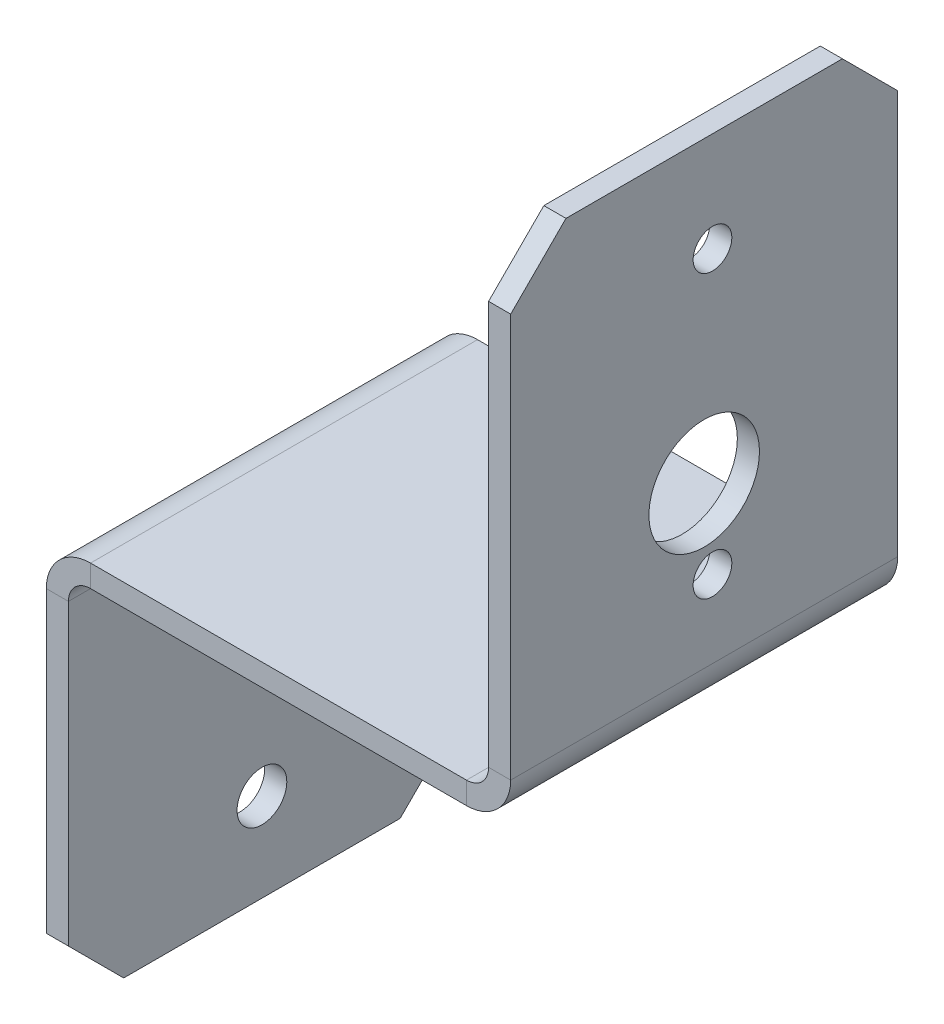
ISO-10303-21;
HEADER;
FILE_DESCRIPTION(('STEP AP214'),'2;1');
FILE_NAME('part.step','',(''),(''),'','','');
FILE_SCHEMA(('AUTOMOTIVE_DESIGN { 1 0 10303 214 1 1 1 1 }'));
ENDSEC;
DATA;
#1=APPLICATION_CONTEXT('core data for automotive mechanical design processes');
#2=APPLICATION_PROTOCOL_DEFINITION('international standard','automotive_design',2000,#1);
#3=PRODUCT_CONTEXT('',#1,'mechanical');
#4=PRODUCT('Part','Part','',(#3));
#5=PRODUCT_RELATED_PRODUCT_CATEGORY('part','',(#4));
#6=PRODUCT_DEFINITION_FORMATION('','',#4);
#7=PRODUCT_DEFINITION_CONTEXT('part definition',#1,'design');
#8=PRODUCT_DEFINITION('design','',#6,#7);
#9=PRODUCT_DEFINITION_SHAPE('','',#8);
#10=(LENGTH_UNIT() NAMED_UNIT(*) SI_UNIT(.MILLI.,.METRE.));
#11=(NAMED_UNIT(*) PLANE_ANGLE_UNIT() SI_UNIT($,.RADIAN.));
#12=(NAMED_UNIT(*) SI_UNIT($,.STERADIAN.) SOLID_ANGLE_UNIT());
#13=UNCERTAINTY_MEASURE_WITH_UNIT(LENGTH_MEASURE(1.E-05),#10,'distance_accuracy_value','');
#14=(GEOMETRIC_REPRESENTATION_CONTEXT(3) GLOBAL_UNCERTAINTY_ASSIGNED_CONTEXT((#13)) GLOBAL_UNIT_ASSIGNED_CONTEXT((#10,
#11,#12)) REPRESENTATION_CONTEXT('',''));
#15=CARTESIAN_POINT('',(0.,0.,0.));
#16=DIRECTION('',(0.,0.,1.));
#17=DIRECTION('',(1.,0.,0.));
#18=AXIS2_PLACEMENT_3D('',#15,#16,#17);
#19=CARTESIAN_POINT('',(-4.,0.,35.));
#20=DIRECTION('',(0.,0.,1.));
#21=DIRECTION('',(1.,0.,0.));
#22=AXIS2_PLACEMENT_3D('',#19,#20,#21);
#23=PLANE('',#22);
#24=DIRECTION('',(0.,1.,0.));
#25=VECTOR('',#24,1.);
#26=CARTESIAN_POINT('',(-4.,0.,35.));
#27=LINE('',#26,#25);
#28=CARTESIAN_POINT('',(-4.,0.,35.));
#29=VERTEX_POINT('',#28);
#30=CARTESIAN_POINT('',(-4.,2.,35.));
#31=VERTEX_POINT('',#30);
#32=EDGE_CURVE('E272',#29,#31,#27,.T.);
#33=ORIENTED_EDGE('',*,*,#32,.F.);
#34=CARTESIAN_POINT('',(-4.,4.,35.));
#35=DIRECTION('',(0.,0.,1.));
#36=DIRECTION('',(1.,0.,0.));
#37=AXIS2_PLACEMENT_3D('',#34,#35,#36);
#38=CIRCLE('',#37,4.);
#39=CARTESIAN_POINT('',(0.,4.,35.));
#40=VERTEX_POINT('',#39);
#41=EDGE_CURVE('E190',#40,#29,#38,.F.);
#42=ORIENTED_EDGE('',*,*,#41,.F.);
#43=DIRECTION('',(1.,0.,0.));
#44=VECTOR('',#43,1.);
#45=CARTESIAN_POINT('',(-2.,4.,35.));
#46=LINE('',#45,#44);
#47=CARTESIAN_POINT('',(-2.,4.,35.));
#48=VERTEX_POINT('',#47);
#49=EDGE_CURVE('E269',#48,#40,#46,.T.);
#50=ORIENTED_EDGE('',*,*,#49,.F.);
#51=CARTESIAN_POINT('',(-4.,4.,35.));
#52=DIRECTION('',(0.,0.,1.));
#53=DIRECTION('',(1.,0.,0.));
#54=AXIS2_PLACEMENT_3D('',#51,#52,#53);
#55=CIRCLE('',#54,2.);
#56=EDGE_CURVE('E200',#48,#31,#55,.F.);
#57=ORIENTED_EDGE('',*,*,#56,.T.);
#58=EDGE_LOOP('',(#33,#42,#50,#57));
#59=FACE_BOUND('',#58,.T.);
#60=ADVANCED_FACE('F34',(#59),#23,.T.);
#61=CARTESIAN_POINT('',(-2.,4.,35.));
#62=DIRECTION('',(0.,0.,1.));
#63=DIRECTION('',(1.,0.,0.));
#64=AXIS2_PLACEMENT_3D('',#61,#62,#63);
#65=PLANE('',#64);
#66=DIRECTION('',(-1.,0.,0.));
#67=VECTOR('',#66,1.);
#68=CARTESIAN_POINT('',(0.,0.,35.));
#69=LINE('',#68,#67);
#70=CARTESIAN_POINT('',(-38.,0.,35.));
#71=VERTEX_POINT('',#70);
#72=EDGE_CURVE('E188',#29,#71,#69,.T.);
#73=ORIENTED_EDGE('',*,*,#72,.F.);
#74=ORIENTED_EDGE('',*,*,#32,.T.);
#75=DIRECTION('',(-1.,0.,0.));
#76=VECTOR('',#75,1.);
#77=CARTESIAN_POINT('',(0.,2.,35.));
#78=LINE('',#77,#76);
#79=CARTESIAN_POINT('',(-38.,2.,35.));
#80=VERTEX_POINT('',#79);
#81=EDGE_CURVE('E203',#31,#80,#78,.T.);
#82=ORIENTED_EDGE('',*,*,#81,.T.);
#83=DIRECTION('',(0.,-1.,0.));
#84=VECTOR('',#83,1.);
#85=CARTESIAN_POINT('',(-38.,2.,35.));
#86=LINE('',#85,#84);
#87=EDGE_CURVE('E161',#80,#71,#86,.T.);
#88=ORIENTED_EDGE('',*,*,#87,.T.);
#89=EDGE_LOOP('',(#73,#74,#82,#88));
#90=FACE_BOUND('',#89,.T.);
#91=ADVANCED_FACE('F349',(#90),#65,.T.);
#92=CARTESIAN_POINT('',(0.,4.,0.));
#93=DIRECTION('',(0.,0.,-1.));
#94=DIRECTION('',(-1.,0.,0.));
#95=AXIS2_PLACEMENT_3D('',#92,#93,#94);
#96=PLANE('',#95);
#97=DIRECTION('',(-1.,0.,0.));
#98=VECTOR('',#97,1.);
#99=CARTESIAN_POINT('',(0.,4.,0.));
#100=LINE('',#99,#98);
#101=CARTESIAN_POINT('',(0.,4.,0.));
#102=VERTEX_POINT('',#101);
#103=CARTESIAN_POINT('',(-2.,4.,0.));
#104=VERTEX_POINT('',#103);
#105=EDGE_CURVE('E266',#102,#104,#100,.T.);
#106=ORIENTED_EDGE('',*,*,#105,.F.);
#107=CARTESIAN_POINT('',(-4.,4.,0.));
#108=DIRECTION('',(0.,0.,1.));
#109=DIRECTION('',(1.,0.,0.));
#110=AXIS2_PLACEMENT_3D('',#107,#108,#109);
#111=CIRCLE('',#110,4.);
#112=CARTESIAN_POINT('',(-4.,0.,0.));
#113=VERTEX_POINT('',#112);
#114=EDGE_CURVE('E218',#102,#113,#111,.F.);
#115=ORIENTED_EDGE('',*,*,#114,.T.);
#116=DIRECTION('',(0.,-1.,0.));
#117=VECTOR('',#116,1.);
#118=CARTESIAN_POINT('',(-4.,2.,0.));
#119=LINE('',#118,#117);
#120=CARTESIAN_POINT('',(-4.,2.,0.));
#121=VERTEX_POINT('',#120);
#122=EDGE_CURVE('E160',#121,#113,#119,.T.);
#123=ORIENTED_EDGE('',*,*,#122,.F.);
#124=CARTESIAN_POINT('',(-4.,4.,0.));
#125=DIRECTION('',(0.,0.,1.));
#126=DIRECTION('',(1.,0.,0.));
#127=AXIS2_PLACEMENT_3D('',#124,#125,#126);
#128=CIRCLE('',#127,2.);
#129=EDGE_CURVE('E225',#104,#121,#128,.F.);
#130=ORIENTED_EDGE('',*,*,#129,.F.);
#131=EDGE_LOOP('',(#106,#115,#123,#130));
#132=FACE_BOUND('',#131,.T.);
#133=ADVANCED_FACE('F416',(#132),#96,.T.);
#134=CARTESIAN_POINT('',(-4.,2.,0.));
#135=DIRECTION('',(0.,0.,-1.));
#136=DIRECTION('',(-1.,0.,0.));
#137=AXIS2_PLACEMENT_3D('',#134,#135,#136);
#138=PLANE('',#137);
#139=DIRECTION('',(0.,1.,0.));
#140=VECTOR('',#139,1.);
#141=CARTESIAN_POINT('',(-2.,0.,0.));
#142=LINE('',#141,#140);
#143=CARTESIAN_POINT('',(-2.,40.5,0.));
#144=VERTEX_POINT('',#143);
#145=EDGE_CURVE('E223',#144,#104,#142,.F.);
#146=ORIENTED_EDGE('',*,*,#145,.F.);
#147=DIRECTION('',(1.,0.,0.));
#148=VECTOR('',#147,1.);
#149=CARTESIAN_POINT('',(-4.,40.5,0.));
#150=LINE('',#149,#148);
#151=CARTESIAN_POINT('',(0.,40.5,0.));
#152=VERTEX_POINT('',#151);
#153=EDGE_CURVE('E302',#144,#152,#150,.T.);
#154=ORIENTED_EDGE('',*,*,#153,.T.);
#155=DIRECTION('',(0.,-1.,0.));
#156=VECTOR('',#155,1.);
#157=CARTESIAN_POINT('',(0.,0.,0.));
#158=LINE('',#157,#156);
#159=EDGE_CURVE('E221',#152,#102,#158,.T.);
#160=ORIENTED_EDGE('',*,*,#159,.T.);
#161=ORIENTED_EDGE('',*,*,#105,.T.);
#162=EDGE_LOOP('',(#146,#154,#160,#161));
#163=FACE_BOUND('',#162,.T.);
#164=ADVANCED_FACE('F322',(#163),#138,.T.);
#165=CARTESIAN_POINT('',(-40.,-2.,35.));
#166=DIRECTION('',(0.,0.,1.));
#167=DIRECTION('',(1.,0.,0.));
#168=AXIS2_PLACEMENT_3D('',#165,#166,#167);
#169=PLANE('',#168);
#170=DIRECTION('',(-1.,0.,0.));
#171=VECTOR('',#170,1.);
#172=CARTESIAN_POINT('',(-40.,-2.,35.));
#173=LINE('',#172,#171);
#174=CARTESIAN_POINT('',(-40.,-2.,35.));
#175=VERTEX_POINT('',#174);
#176=CARTESIAN_POINT('',(-42.,-2.,35.));
#177=VERTEX_POINT('',#176);
#178=EDGE_CURVE('E148',#175,#177,#173,.T.);
#179=ORIENTED_EDGE('',*,*,#178,.F.);
#180=CARTESIAN_POINT('',(-38.,-2.,35.));
#181=DIRECTION('',(0.,0.,-1.));
#182=DIRECTION('',(-1.,0.,0.));
#183=AXIS2_PLACEMENT_3D('',#180,#181,#182);
#184=CIRCLE('',#183,2.);
#185=EDGE_CURVE('E152',#71,#175,#184,.F.);
#186=ORIENTED_EDGE('',*,*,#185,.F.);
#187=ORIENTED_EDGE('',*,*,#87,.F.);
#188=CARTESIAN_POINT('',(-38.,-2.,35.));
#189=DIRECTION('',(0.,0.,1.));
#190=DIRECTION('',(1.,0.,0.));
#191=AXIS2_PLACEMENT_3D('',#188,#189,#190);
#192=CIRCLE('',#191,4.);
#193=EDGE_CURVE('E155',#80,#177,#192,.T.);
#194=ORIENTED_EDGE('',*,*,#193,.T.);
#195=EDGE_LOOP('',(#179,#186,#187,#194));
#196=FACE_BOUND('',#195,.T.);
#197=ADVANCED_FACE('F150',(#196),#169,.T.);
#198=CARTESIAN_POINT('',(-38.,2.,35.));
#199=DIRECTION('',(0.,0.,1.));
#200=DIRECTION('',(1.,0.,0.));
#201=AXIS2_PLACEMENT_3D('',#198,#199,#200);
#202=PLANE('',#201);
#203=DIRECTION('',(0.,1.,0.));
#204=VECTOR('',#203,1.);
#205=CARTESIAN_POINT('',(-42.,0.,35.));
#206=LINE('',#205,#204);
#207=CARTESIAN_POINT('',(-42.,-29.,35.));
#208=VERTEX_POINT('',#207);
#209=EDGE_CURVE('E183',#177,#208,#206,.F.);
#210=ORIENTED_EDGE('',*,*,#209,.T.);
#211=DIRECTION('',(1.,0.,0.));
#212=VECTOR('',#211,1.);
#213=CARTESIAN_POINT('',(-38.,-29.,35.));
#214=LINE('',#213,#212);
#215=CARTESIAN_POINT('',(-40.,-29.,35.));
#216=VERTEX_POINT('',#215);
#217=EDGE_CURVE('E182',#208,#216,#214,.T.);
#218=ORIENTED_EDGE('',*,*,#217,.T.);
#219=DIRECTION('',(0.,-1.,0.));
#220=VECTOR('',#219,1.);
#221=CARTESIAN_POINT('',(-40.,0.,35.));
#222=LINE('',#221,#220);
#223=EDGE_CURVE('E170',#175,#216,#222,.T.);
#224=ORIENTED_EDGE('',*,*,#223,.F.);
#225=ORIENTED_EDGE('',*,*,#178,.T.);
#226=EDGE_LOOP('',(#210,#218,#224,#225));
#227=FACE_BOUND('',#226,.T.);
#228=ADVANCED_FACE('F180',(#227),#202,.T.);
#229=CARTESIAN_POINT('',(-38.,0.,0.));
#230=DIRECTION('',(0.,0.,-1.));
#231=DIRECTION('',(-1.,0.,0.));
#232=AXIS2_PLACEMENT_3D('',#229,#230,#231);
#233=PLANE('',#232);
#234=DIRECTION('',(0.,1.,0.));
#235=VECTOR('',#234,1.);
#236=CARTESIAN_POINT('',(-38.,0.,0.));
#237=LINE('',#236,#235);
#238=CARTESIAN_POINT('',(-38.,0.,0.));
#239=VERTEX_POINT('',#238);
#240=CARTESIAN_POINT('',(-38.,2.,0.));
#241=VERTEX_POINT('',#240);
#242=EDGE_CURVE('E262',#239,#241,#237,.T.);
#243=ORIENTED_EDGE('',*,*,#242,.F.);
#244=CARTESIAN_POINT('',(-38.,-2.,0.));
#245=DIRECTION('',(0.,0.,-1.));
#246=DIRECTION('',(-1.,0.,0.));
#247=AXIS2_PLACEMENT_3D('',#244,#245,#246);
#248=CIRCLE('',#247,2.);
#249=CARTESIAN_POINT('',(-40.,-2.,0.));
#250=VERTEX_POINT('',#249);
#251=EDGE_CURVE('E213',#239,#250,#248,.F.);
#252=ORIENTED_EDGE('',*,*,#251,.T.);
#253=DIRECTION('',(1.,0.,0.));
#254=VECTOR('',#253,1.);
#255=CARTESIAN_POINT('',(-42.,-2.,0.));
#256=LINE('',#255,#254);
#257=CARTESIAN_POINT('',(-42.,-2.,0.));
#258=VERTEX_POINT('',#257);
#259=EDGE_CURVE('E260',#258,#250,#256,.T.);
#260=ORIENTED_EDGE('',*,*,#259,.F.);
#261=CARTESIAN_POINT('',(-38.,-2.,0.));
#262=DIRECTION('',(0.,0.,1.));
#263=DIRECTION('',(1.,0.,0.));
#264=AXIS2_PLACEMENT_3D('',#261,#262,#263);
#265=CIRCLE('',#264,4.);
#266=EDGE_CURVE('E231',#241,#258,#265,.T.);
#267=ORIENTED_EDGE('',*,*,#266,.F.);
#268=EDGE_LOOP('',(#243,#252,#260,#267));
#269=FACE_BOUND('',#268,.T.);
#270=ADVANCED_FACE('F408',(#269),#233,.T.);
#271=CARTESIAN_POINT('',(-42.,-2.,0.));
#272=DIRECTION('',(0.,0.,-1.));
#273=DIRECTION('',(-1.,0.,0.));
#274=AXIS2_PLACEMENT_3D('',#271,#272,#273);
#275=PLANE('',#274);
#276=DIRECTION('',(-1.,0.,0.));
#277=VECTOR('',#276,1.);
#278=CARTESIAN_POINT('',(0.,0.,0.));
#279=LINE('',#278,#277);
#280=EDGE_CURVE('E215',#113,#239,#279,.T.);
#281=ORIENTED_EDGE('',*,*,#280,.T.);
#282=ORIENTED_EDGE('',*,*,#242,.T.);
#283=DIRECTION('',(-1.,0.,0.));
#284=VECTOR('',#283,1.);
#285=CARTESIAN_POINT('',(0.,2.,0.));
#286=LINE('',#285,#284);
#287=EDGE_CURVE('E228',#121,#241,#286,.T.);
#288=ORIENTED_EDGE('',*,*,#287,.F.);
#289=ORIENTED_EDGE('',*,*,#122,.T.);
#290=EDGE_LOOP('',(#281,#282,#288,#289));
#291=FACE_BOUND('',#290,.T.);
#292=ADVANCED_FACE('F399',(#291),#275,.T.);
#293=CARTESIAN_POINT('',(-42.,0.,35.));
#294=DIRECTION('',(1.,0.,0.));
#295=DIRECTION('',(0.,0.,-1.));
#296=AXIS2_PLACEMENT_3D('',#293,#294,#295);
#297=PLANE('',#296);
#298=CARTESIAN_POINT('',(-42.,-10.,17.5));
#299=DIRECTION('',(1.,0.,0.));
#300=DIRECTION('',(0.,0.,-1.));
#301=AXIS2_PLACEMENT_3D('',#298,#299,#300);
#302=CIRCLE('',#301,2.24999999999971);
#303=CARTESIAN_POINT('',(-42.,-10.,15.2500000000003));
#304=VERTEX_POINT('',#303);
#305=EDGE_CURVE('E376',#304,#304,#302,.T.);
#306=ORIENTED_EDGE('',*,*,#305,.T.);
#307=EDGE_LOOP('',(#306));
#308=FACE_BOUND('',#307,.T.);
#309=CARTESIAN_POINT('',(-42.,-26.,17.5));
#310=DIRECTION('',(1.,0.,0.));
#311=DIRECTION('',(0.,0.,-1.));
#312=AXIS2_PLACEMENT_3D('',#309,#310,#311);
#313=CIRCLE('',#312,2.25);
#314=CARTESIAN_POINT('',(-42.,-26.,15.25));
#315=VERTEX_POINT('',#314);
#316=EDGE_CURVE('E370',#315,#315,#313,.T.);
#317=ORIENTED_EDGE('',*,*,#316,.T.);
#318=EDGE_LOOP('',(#317));
#319=FACE_BOUND('',#318,.T.);
#320=DIRECTION('',(0.,1.,0.));
#321=VECTOR('',#320,1.);
#322=CARTESIAN_POINT('',(-42.,0.,0.));
#323=LINE('',#322,#321);
#324=CARTESIAN_POINT('',(-42.,-29.,0.));
#325=VERTEX_POINT('',#324);
#326=EDGE_CURVE('E208',#258,#325,#323,.F.);
#327=ORIENTED_EDGE('',*,*,#326,.T.);
#328=DIRECTION('',(0.,0.707106781186546,-0.70710678118655));
#329=VECTOR('',#328,1.);
#330=CARTESIAN_POINT('',(-42.,-29.,0.));
#331=LINE('',#330,#329);
#332=CARTESIAN_POINT('',(-42.,-34.,5.00000000000002));
#333=VERTEX_POINT('',#332);
#334=EDGE_CURVE('E290',#325,#333,#331,.F.);
#335=ORIENTED_EDGE('',*,*,#334,.T.);
#336=DIRECTION('',(0.,0.,-1.));
#337=VECTOR('',#336,1.);
#338=CARTESIAN_POINT('',(-42.,-34.,35.));
#339=LINE('',#338,#337);
#340=CARTESIAN_POINT('',(-42.,-34.,30.));
#341=VERTEX_POINT('',#340);
#342=EDGE_CURVE('E257',#341,#333,#339,.T.);
#343=ORIENTED_EDGE('',*,*,#342,.F.);
#344=DIRECTION('',(0.,-0.707106781186549,-0.707106781186546));
#345=VECTOR('',#344,1.);
#346=CARTESIAN_POINT('',(-42.,-34.,30.));
#347=LINE('',#346,#345);
#348=EDGE_CURVE('E288',#341,#208,#347,.F.);
#349=ORIENTED_EDGE('',*,*,#348,.T.);
#350=ORIENTED_EDGE('',*,*,#209,.F.);
#351=DIRECTION('',(0.,0.,-1.));
#352=VECTOR('',#351,1.);
#353=CARTESIAN_POINT('',(-42.,-2.,35.));
#354=LINE('',#353,#352);
#355=EDGE_CURVE('E207',#177,#258,#354,.T.);
#356=ORIENTED_EDGE('',*,*,#355,.T.);
#357=EDGE_LOOP('',(#327,#335,#343,#349,#350,#356));
#358=FACE_BOUND('',#357,.T.);
#359=ADVANCED_FACE('F361',(#308,#319,#358),#297,.F.);
#360=CARTESIAN_POINT('',(-40.,-34.,35.));
#361=DIRECTION('',(0.,-1.,0.));
#362=DIRECTION('',(0.,0.,-1.));
#363=AXIS2_PLACEMENT_3D('',#360,#361,#362);
#364=PLANE('',#363);
#365=ORIENTED_EDGE('',*,*,#342,.T.);
#366=DIRECTION('',(1.,0.,0.));
#367=VECTOR('',#366,1.);
#368=CARTESIAN_POINT('',(-40.,-34.,5.00000000000002));
#369=LINE('',#368,#367);
#370=CARTESIAN_POINT('',(-40.,-34.,5.00000000000004));
#371=VERTEX_POINT('',#370);
#372=EDGE_CURVE('E295',#333,#371,#369,.T.);
#373=ORIENTED_EDGE('',*,*,#372,.T.);
#374=DIRECTION('',(0.,0.,-1.));
#375=VECTOR('',#374,1.);
#376=CARTESIAN_POINT('',(-40.,-34.,35.));
#377=LINE('',#376,#375);
#378=CARTESIAN_POINT('',(-40.,-34.,30.));
#379=VERTEX_POINT('',#378);
#380=EDGE_CURVE('E177',#379,#371,#377,.T.);
#381=ORIENTED_EDGE('',*,*,#380,.F.);
#382=DIRECTION('',(-1.,0.,0.));
#383=VECTOR('',#382,1.);
#384=CARTESIAN_POINT('',(-40.,-34.,30.));
#385=LINE('',#384,#383);
#386=EDGE_CURVE('E292',#379,#341,#385,.T.);
#387=ORIENTED_EDGE('',*,*,#386,.T.);
#388=EDGE_LOOP('',(#365,#373,#381,#387));
#389=FACE_BOUND('',#388,.T.);
#390=ADVANCED_FACE('F388',(#389),#364,.T.);
#391=CARTESIAN_POINT('',(-40.,0.,35.));
#392=DIRECTION('',(1.,0.,0.));
#393=DIRECTION('',(0.,0.,-1.));
#394=AXIS2_PLACEMENT_3D('',#391,#392,#393);
#395=PLANE('',#394);
#396=CARTESIAN_POINT('',(-40.,-10.,17.5));
#397=DIRECTION('',(1.,0.,0.));
#398=DIRECTION('',(0.,1.,0.));
#399=AXIS2_PLACEMENT_3D('',#396,#397,#398);
#400=CIRCLE('',#399,2.24999999999971);
#401=CARTESIAN_POINT('',(-40.,-7.7500000000003,17.5));
#402=VERTEX_POINT('',#401);
#403=EDGE_CURVE('E379',#402,#402,#400,.T.);
#404=ORIENTED_EDGE('',*,*,#403,.F.);
#405=EDGE_LOOP('',(#404));
#406=FACE_BOUND('',#405,.T.);
#407=CARTESIAN_POINT('',(-40.,-26.,17.5));
#408=DIRECTION('',(1.,0.,0.));
#409=DIRECTION('',(0.,1.,0.));
#410=AXIS2_PLACEMENT_3D('',#407,#408,#409);
#411=CIRCLE('',#410,2.25);
#412=CARTESIAN_POINT('',(-40.,-23.75,17.5));
#413=VERTEX_POINT('',#412);
#414=EDGE_CURVE('E373',#413,#413,#411,.T.);
#415=ORIENTED_EDGE('',*,*,#414,.F.);
#416=EDGE_LOOP('',(#415));
#417=FACE_BOUND('',#416,.T.);
#418=ORIENTED_EDGE('',*,*,#380,.T.);
#419=DIRECTION('',(0.,-0.707106781186546,0.70710678118655));
#420=VECTOR('',#419,1.);
#421=CARTESIAN_POINT('',(-40.,-32.0000000000001,3.0000000000001));
#422=LINE('',#421,#420);
#423=CARTESIAN_POINT('',(-40.,-29.,0.));
#424=VERTEX_POINT('',#423);
#425=EDGE_CURVE('E299',#371,#424,#422,.F.);
#426=ORIENTED_EDGE('',*,*,#425,.T.);
#427=DIRECTION('',(0.,-1.,0.));
#428=VECTOR('',#427,1.);
#429=CARTESIAN_POINT('',(-40.,0.,0.));
#430=LINE('',#429,#428);
#431=EDGE_CURVE('E173',#250,#424,#430,.T.);
#432=ORIENTED_EDGE('',*,*,#431,.F.);
#433=DIRECTION('',(0.,0.,-1.));
#434=VECTOR('',#433,1.);
#435=CARTESIAN_POINT('',(-40.,-2.,35.));
#436=LINE('',#435,#434);
#437=EDGE_CURVE('E167',#175,#250,#436,.T.);
#438=ORIENTED_EDGE('',*,*,#437,.F.);
#439=ORIENTED_EDGE('',*,*,#223,.T.);
#440=DIRECTION('',(0.,0.707106781186549,0.707106781186546));
#441=VECTOR('',#440,1.);
#442=CARTESIAN_POINT('',(-40.,-14.4999999999999,49.5));
#443=LINE('',#442,#441);
#444=EDGE_CURVE('E297',#216,#379,#443,.F.);
#445=ORIENTED_EDGE('',*,*,#444,.T.);
#446=EDGE_LOOP('',(#418,#426,#432,#438,#439,#445));
#447=FACE_BOUND('',#446,.T.);
#448=ADVANCED_FACE('F169',(#406,#417,#447),#395,.T.);
#449=CARTESIAN_POINT('',(-38.,-2.,35.));
#450=DIRECTION('',(0.,0.,-1.));
#451=DIRECTION('',(-1.,0.,0.));
#452=AXIS2_PLACEMENT_3D('',#449,#450,#451);
#453=CYLINDRICAL_SURFACE('',#452,2.);
#454=ORIENTED_EDGE('',*,*,#251,.F.);
#455=DIRECTION('',(0.,0.,-1.));
#456=VECTOR('',#455,1.);
#457=CARTESIAN_POINT('',(-38.,0.,35.));
#458=LINE('',#457,#456);
#459=EDGE_CURVE('E178',#71,#239,#458,.T.);
#460=ORIENTED_EDGE('',*,*,#459,.F.);
#461=ORIENTED_EDGE('',*,*,#185,.T.);
#462=ORIENTED_EDGE('',*,*,#437,.T.);
#463=EDGE_LOOP('',(#454,#460,#461,#462));
#464=FACE_BOUND('',#463,.T.);
#465=ADVANCED_FACE('F186',(#464),#453,.F.);
#466=CARTESIAN_POINT('',(0.,0.,35.));
#467=DIRECTION('',(0.,-1.,0.));
#468=DIRECTION('',(1.,0.,0.));
#469=AXIS2_PLACEMENT_3D('',#466,#467,#468);
#470=PLANE('',#469);
#471=ORIENTED_EDGE('',*,*,#280,.F.);
#472=DIRECTION('',(0.,0.,-1.));
#473=VECTOR('',#472,1.);
#474=CARTESIAN_POINT('',(-4.,0.,35.));
#475=LINE('',#474,#473);
#476=EDGE_CURVE('E252',#29,#113,#475,.T.);
#477=ORIENTED_EDGE('',*,*,#476,.F.);
#478=ORIENTED_EDGE('',*,*,#72,.T.);
#479=ORIENTED_EDGE('',*,*,#459,.T.);
#480=EDGE_LOOP('',(#471,#477,#478,#479));
#481=FACE_BOUND('',#480,.T.);
#482=ADVANCED_FACE('F348',(#481),#470,.T.);
#483=CARTESIAN_POINT('',(-4.,4.,35.));
#484=DIRECTION('',(0.,0.,-1.));
#485=DIRECTION('',(-1.,0.,0.));
#486=AXIS2_PLACEMENT_3D('',#483,#484,#485);
#487=CYLINDRICAL_SURFACE('',#486,4.);
#488=ORIENTED_EDGE('',*,*,#114,.F.);
#489=DIRECTION('',(0.,0.,-1.));
#490=VECTOR('',#489,1.);
#491=CARTESIAN_POINT('',(0.,4.,35.));
#492=LINE('',#491,#490);
#493=EDGE_CURVE('E249',#40,#102,#492,.T.);
#494=ORIENTED_EDGE('',*,*,#493,.F.);
#495=ORIENTED_EDGE('',*,*,#41,.T.);
#496=ORIENTED_EDGE('',*,*,#476,.T.);
#497=EDGE_LOOP('',(#488,#494,#495,#496));
#498=FACE_BOUND('',#497,.T.);
#499=ADVANCED_FACE('F340',(#498),#487,.T.);
#500=CARTESIAN_POINT('',(0.,0.,35.));
#501=DIRECTION('',(1.,0.,0.));
#502=DIRECTION('',(0.,0.,-1.));
#503=AXIS2_PLACEMENT_3D('',#500,#501,#502);
#504=PLANE('',#503);
#505=CARTESIAN_POINT('',(0.,36.5,16.75));
#506=DIRECTION('',(1.,0.,0.));
#507=DIRECTION('',(0.,0.,-1.));
#508=AXIS2_PLACEMENT_3D('',#505,#506,#507);
#509=CIRCLE('',#508,1.75);
#510=CARTESIAN_POINT('',(0.,36.5,15.));
#511=VERTEX_POINT('',#510);
#512=EDGE_CURVE('E285',#511,#511,#509,.T.);
#513=ORIENTED_EDGE('',*,*,#512,.F.);
#514=EDGE_LOOP('',(#513));
#515=FACE_BOUND('',#514,.T.);
#516=CARTESIAN_POINT('',(0.,11.,16.75));
#517=DIRECTION('',(1.,0.,0.));
#518=DIRECTION('',(0.,0.,-1.));
#519=AXIS2_PLACEMENT_3D('',#516,#517,#518);
#520=CIRCLE('',#519,1.75);
#521=CARTESIAN_POINT('',(0.,11.,15.));
#522=VERTEX_POINT('',#521);
#523=EDGE_CURVE('E281',#522,#522,#520,.T.);
#524=ORIENTED_EDGE('',*,*,#523,.F.);
#525=EDGE_LOOP('',(#524));
#526=FACE_BOUND('',#525,.T.);
#527=CARTESIAN_POINT('',(0.,18.5,17.5));
#528=DIRECTION('',(1.,0.,0.));
#529=DIRECTION('',(0.,0.,-1.));
#530=AXIS2_PLACEMENT_3D('',#527,#528,#529);
#531=CIRCLE('',#530,5.);
#532=CARTESIAN_POINT('',(0.,18.5,12.5));
#533=VERTEX_POINT('',#532);
#534=EDGE_CURVE('E277',#533,#533,#531,.T.);
#535=ORIENTED_EDGE('',*,*,#534,.F.);
#536=EDGE_LOOP('',(#535));
#537=FACE_BOUND('',#536,.T.);
#538=ORIENTED_EDGE('',*,*,#159,.F.);
#539=DIRECTION('',(0.,-0.707106781186546,-0.707106781186549));
#540=VECTOR('',#539,1.);
#541=CARTESIAN_POINT('',(0.,37.7500000000001,-2.7499999999999));
#542=LINE('',#541,#540);
#543=CARTESIAN_POINT('',(0.,45.5,5.00000000000003));
#544=VERTEX_POINT('',#543);
#545=EDGE_CURVE('E307',#152,#544,#542,.F.);
#546=ORIENTED_EDGE('',*,*,#545,.T.);
#547=DIRECTION('',(0.,0.,-1.));
#548=VECTOR('',#547,1.);
#549=CARTESIAN_POINT('',(0.,45.5,35.));
#550=LINE('',#549,#548);
#551=CARTESIAN_POINT('',(0.,45.5,30.));
#552=VERTEX_POINT('',#551);
#553=EDGE_CURVE('E247',#552,#544,#550,.T.);
#554=ORIENTED_EDGE('',*,*,#553,.F.);
#555=DIRECTION('',(0.,-0.707106781186549,0.707106781186546));
#556=VECTOR('',#555,1.);
#557=CARTESIAN_POINT('',(0.,20.2499999999999,55.25));
#558=LINE('',#557,#556);
#559=CARTESIAN_POINT('',(0.,40.5,35.));
#560=VERTEX_POINT('',#559);
#561=EDGE_CURVE('E305',#552,#560,#558,.T.);
#562=ORIENTED_EDGE('',*,*,#561,.T.);
#563=DIRECTION('',(0.,-1.,0.));
#564=VECTOR('',#563,1.);
#565=CARTESIAN_POINT('',(0.,0.,35.));
#566=LINE('',#565,#564);
#567=EDGE_CURVE('E196',#560,#40,#566,.T.);
#568=ORIENTED_EDGE('',*,*,#567,.T.);
#569=ORIENTED_EDGE('',*,*,#493,.T.);
#570=EDGE_LOOP('',(#538,#546,#554,#562,#568,#569));
#571=FACE_BOUND('',#570,.T.);
#572=ADVANCED_FACE('F328',(#515,#526,#537,#571),#504,.T.);
#573=CARTESIAN_POINT('',(-2.,45.5,35.));
#574=DIRECTION('',(0.,1.,0.));
#575=DIRECTION('',(0.,0.,1.));
#576=AXIS2_PLACEMENT_3D('',#573,#574,#575);
#577=PLANE('',#576);
#578=ORIENTED_EDGE('',*,*,#553,.T.);
#579=DIRECTION('',(-1.,0.,0.));
#580=VECTOR('',#579,1.);
#581=CARTESIAN_POINT('',(-2.,45.5,5.00000000000003));
#582=LINE('',#581,#580);
#583=CARTESIAN_POINT('',(-2.,45.5,5.00000000000003));
#584=VERTEX_POINT('',#583);
#585=EDGE_CURVE('E55',#544,#584,#582,.T.);
#586=ORIENTED_EDGE('',*,*,#585,.T.);
#587=DIRECTION('',(0.,0.,-1.));
#588=VECTOR('',#587,1.);
#589=CARTESIAN_POINT('',(-2.,45.5,35.));
#590=LINE('',#589,#588);
#591=CARTESIAN_POINT('',(-2.,45.5,30.));
#592=VERTEX_POINT('',#591);
#593=EDGE_CURVE('E245',#592,#584,#590,.T.);
#594=ORIENTED_EDGE('',*,*,#593,.F.);
#595=DIRECTION('',(1.,0.,0.));
#596=VECTOR('',#595,1.);
#597=CARTESIAN_POINT('',(0.,45.5,30.));
#598=LINE('',#597,#596);
#599=EDGE_CURVE('E309',#592,#552,#598,.T.);
#600=ORIENTED_EDGE('',*,*,#599,.T.);
#601=EDGE_LOOP('',(#578,#586,#594,#600));
#602=FACE_BOUND('',#601,.T.);
#603=ADVANCED_FACE('F329',(#602),#577,.T.);
#604=CARTESIAN_POINT('',(-2.,0.,35.));
#605=DIRECTION('',(1.,0.,0.));
#606=DIRECTION('',(0.,0.,-1.));
#607=AXIS2_PLACEMENT_3D('',#604,#605,#606);
#608=PLANE('',#607);
#609=CARTESIAN_POINT('',(-2.,36.5,16.75));
#610=DIRECTION('',(1.,0.,0.));
#611=DIRECTION('',(0.,0.,-1.));
#612=AXIS2_PLACEMENT_3D('',#609,#610,#611);
#613=CIRCLE('',#612,1.75);
#614=CARTESIAN_POINT('',(-2.,36.5,15.));
#615=VERTEX_POINT('',#614);
#616=EDGE_CURVE('E282',#615,#615,#613,.T.);
#617=ORIENTED_EDGE('',*,*,#616,.T.);
#618=EDGE_LOOP('',(#617));
#619=FACE_BOUND('',#618,.T.);
#620=CARTESIAN_POINT('',(-2.,11.,16.75));
#621=DIRECTION('',(1.,0.,0.));
#622=DIRECTION('',(0.,0.,-1.));
#623=AXIS2_PLACEMENT_3D('',#620,#621,#622);
#624=CIRCLE('',#623,1.75);
#625=CARTESIAN_POINT('',(-2.,11.,15.));
#626=VERTEX_POINT('',#625);
#627=EDGE_CURVE('E278',#626,#626,#624,.T.);
#628=ORIENTED_EDGE('',*,*,#627,.T.);
#629=EDGE_LOOP('',(#628));
#630=FACE_BOUND('',#629,.T.);
#631=CARTESIAN_POINT('',(-2.,18.5,17.5));
#632=DIRECTION('',(1.,0.,0.));
#633=DIRECTION('',(0.,0.,-1.));
#634=AXIS2_PLACEMENT_3D('',#631,#632,#633);
#635=CIRCLE('',#634,5.);
#636=CARTESIAN_POINT('',(-2.,18.5,12.5));
#637=VERTEX_POINT('',#636);
#638=EDGE_CURVE('E211',#637,#637,#635,.T.);
#639=ORIENTED_EDGE('',*,*,#638,.T.);
#640=EDGE_LOOP('',(#639));
#641=FACE_BOUND('',#640,.T.);
#642=ORIENTED_EDGE('',*,*,#593,.T.);
#643=DIRECTION('',(0.,0.707106781186546,0.707106781186549));
#644=VECTOR('',#643,1.);
#645=CARTESIAN_POINT('',(-2.,40.5,0.));
#646=LINE('',#645,#644);
#647=EDGE_CURVE('E42',#584,#144,#646,.F.);
#648=ORIENTED_EDGE('',*,*,#647,.T.);
#649=ORIENTED_EDGE('',*,*,#145,.T.);
#650=DIRECTION('',(0.,0.,-1.));
#651=VECTOR('',#650,1.);
#652=CARTESIAN_POINT('',(-2.,4.,35.));
#653=LINE('',#652,#651);
#654=EDGE_CURVE('E242',#48,#104,#653,.T.);
#655=ORIENTED_EDGE('',*,*,#654,.F.);
#656=DIRECTION('',(0.,1.,0.));
#657=VECTOR('',#656,1.);
#658=CARTESIAN_POINT('',(-2.,0.,35.));
#659=LINE('',#658,#657);
#660=CARTESIAN_POINT('',(-2.,40.5,35.));
#661=VERTEX_POINT('',#660);
#662=EDGE_CURVE('E198',#661,#48,#659,.F.);
#663=ORIENTED_EDGE('',*,*,#662,.F.);
#664=DIRECTION('',(0.,0.707106781186549,-0.707106781186546));
#665=VECTOR('',#664,1.);
#666=CARTESIAN_POINT('',(-2.,45.5,30.));
#667=LINE('',#666,#665);
#668=EDGE_CURVE('E313',#661,#592,#667,.T.);
#669=ORIENTED_EDGE('',*,*,#668,.T.);
#670=EDGE_LOOP('',(#642,#648,#649,#655,#663,#669));
#671=FACE_BOUND('',#670,.T.);
#672=ADVANCED_FACE('F317',(#619,#630,#641,#671),#608,.F.);
#673=CARTESIAN_POINT('',(-4.,4.,35.));
#674=DIRECTION('',(0.,0.,-1.));
#675=DIRECTION('',(-1.,0.,0.));
#676=AXIS2_PLACEMENT_3D('',#673,#674,#675);
#677=CYLINDRICAL_SURFACE('',#676,2.);
#678=ORIENTED_EDGE('',*,*,#129,.T.);
#679=DIRECTION('',(0.,0.,-1.));
#680=VECTOR('',#679,1.);
#681=CARTESIAN_POINT('',(-4.,2.,35.));
#682=LINE('',#681,#680);
#683=EDGE_CURVE('E239',#31,#121,#682,.T.);
#684=ORIENTED_EDGE('',*,*,#683,.F.);
#685=ORIENTED_EDGE('',*,*,#56,.F.);
#686=ORIENTED_EDGE('',*,*,#654,.T.);
#687=EDGE_LOOP('',(#678,#684,#685,#686));
#688=FACE_BOUND('',#687,.T.);
#689=ADVANCED_FACE('F544',(#688),#677,.F.);
#690=CARTESIAN_POINT('',(0.,2.,35.));
#691=DIRECTION('',(0.,-1.,0.));
#692=DIRECTION('',(1.,0.,0.));
#693=AXIS2_PLACEMENT_3D('',#690,#691,#692);
#694=PLANE('',#693);
#695=ORIENTED_EDGE('',*,*,#287,.T.);
#696=DIRECTION('',(0.,0.,-1.));
#697=VECTOR('',#696,1.);
#698=CARTESIAN_POINT('',(-38.,2.,35.));
#699=LINE('',#698,#697);
#700=EDGE_CURVE('E236',#80,#241,#699,.T.);
#701=ORIENTED_EDGE('',*,*,#700,.F.);
#702=ORIENTED_EDGE('',*,*,#81,.F.);
#703=ORIENTED_EDGE('',*,*,#683,.T.);
#704=EDGE_LOOP('',(#695,#701,#702,#703));
#705=FACE_BOUND('',#704,.T.);
#706=ADVANCED_FACE('F353',(#705),#694,.F.);
#707=CARTESIAN_POINT('',(-38.,-2.,35.));
#708=DIRECTION('',(0.,0.,-1.));
#709=DIRECTION('',(-1.,0.,0.));
#710=AXIS2_PLACEMENT_3D('',#707,#708,#709);
#711=CYLINDRICAL_SURFACE('',#710,4.);
#712=ORIENTED_EDGE('',*,*,#266,.T.);
#713=ORIENTED_EDGE('',*,*,#355,.F.);
#714=ORIENTED_EDGE('',*,*,#193,.F.);
#715=ORIENTED_EDGE('',*,*,#700,.T.);
#716=EDGE_LOOP('',(#712,#713,#714,#715));
#717=FACE_BOUND('',#716,.T.);
#718=ADVANCED_FACE('F357',(#717),#711,.T.);
#719=CARTESIAN_POINT('',(-38.,-2.,35.));
#720=DIRECTION('',(0.,0.,-1.));
#721=DIRECTION('',(-1.,0.,0.));
#722=AXIS2_PLACEMENT_3D('',#719,#720,#721);
#723=PLANE('',#722);
#724=ORIENTED_EDGE('',*,*,#567,.F.);
#725=DIRECTION('',(-1.,0.,0.));
#726=VECTOR('',#725,1.);
#727=CARTESIAN_POINT('',(-2.,40.5,35.));
#728=LINE('',#727,#726);
#729=EDGE_CURVE('E11',#560,#661,#728,.T.);
#730=ORIENTED_EDGE('',*,*,#729,.T.);
#731=ORIENTED_EDGE('',*,*,#662,.T.);
#732=ORIENTED_EDGE('',*,*,#49,.T.);
#733=EDGE_LOOP('',(#724,#730,#731,#732));
#734=FACE_BOUND('',#733,.T.);
#735=ADVANCED_FACE('F333',(#734),#723,.F.);
#736=CARTESIAN_POINT('',(-38.,-2.,0.));
#737=DIRECTION('',(0.,0.,-1.));
#738=DIRECTION('',(-1.,0.,0.));
#739=AXIS2_PLACEMENT_3D('',#736,#737,#738);
#740=PLANE('',#739);
#741=ORIENTED_EDGE('',*,*,#431,.T.);
#742=DIRECTION('',(-1.,0.,0.));
#743=VECTOR('',#742,1.);
#744=CARTESIAN_POINT('',(-38.,-29.,0.));
#745=LINE('',#744,#743);
#746=EDGE_CURVE('E274',#424,#325,#745,.T.);
#747=ORIENTED_EDGE('',*,*,#746,.T.);
#748=ORIENTED_EDGE('',*,*,#326,.F.);
#749=ORIENTED_EDGE('',*,*,#259,.T.);
#750=EDGE_LOOP('',(#741,#747,#748,#749));
#751=FACE_BOUND('',#750,.T.);
#752=ADVANCED_FACE('F502',(#751),#740,.T.);
#753=CARTESIAN_POINT('',(-10.,18.5,17.5));
#754=DIRECTION('',(1.,0.,0.));
#755=DIRECTION('',(0.,0.,-1.));
#756=AXIS2_PLACEMENT_3D('',#753,#754,#755);
#757=CYLINDRICAL_SURFACE('',#756,5.);
#758=ORIENTED_EDGE('',*,*,#534,.T.);
#759=EDGE_LOOP('',(#758));
#760=FACE_BOUND('',#759,.T.);
#761=ORIENTED_EDGE('',*,*,#638,.F.);
#762=EDGE_LOOP('',(#761));
#763=FACE_BOUND('',#762,.T.);
#764=ADVANCED_FACE('F491',(#760,#763),#757,.F.);
#765=CARTESIAN_POINT('',(-10.,11.,16.75));
#766=DIRECTION('',(1.,0.,0.));
#767=DIRECTION('',(0.,0.,-1.));
#768=AXIS2_PLACEMENT_3D('',#765,#766,#767);
#769=CYLINDRICAL_SURFACE('',#768,1.75);
#770=ORIENTED_EDGE('',*,*,#523,.T.);
#771=EDGE_LOOP('',(#770));
#772=FACE_BOUND('',#771,.T.);
#773=ORIENTED_EDGE('',*,*,#627,.F.);
#774=EDGE_LOOP('',(#773));
#775=FACE_BOUND('',#774,.T.);
#776=ADVANCED_FACE('F479',(#772,#775),#769,.F.);
#777=CARTESIAN_POINT('',(-10.,36.5,16.75));
#778=DIRECTION('',(1.,0.,0.));
#779=DIRECTION('',(0.,0.,-1.));
#780=AXIS2_PLACEMENT_3D('',#777,#778,#779);
#781=CYLINDRICAL_SURFACE('',#780,1.75);
#782=ORIENTED_EDGE('',*,*,#512,.T.);
#783=EDGE_LOOP('',(#782));
#784=FACE_BOUND('',#783,.T.);
#785=ORIENTED_EDGE('',*,*,#616,.F.);
#786=EDGE_LOOP('',(#785));
#787=FACE_BOUND('',#786,.T.);
#788=ADVANCED_FACE('F424',(#784,#787),#781,.F.);
#789=CARTESIAN_POINT('',(-38.,-29.,0.));
#790=DIRECTION('',(0.,0.707106781186549,0.707106781186545));
#791=DIRECTION('',(0.,-0.707106781186546,0.70710678118655));
#792=AXIS2_PLACEMENT_3D('',#789,#790,#791);
#793=PLANE('',#792);
#794=ORIENTED_EDGE('',*,*,#425,.F.);
#795=ORIENTED_EDGE('',*,*,#372,.F.);
#796=ORIENTED_EDGE('',*,*,#334,.F.);
#797=ORIENTED_EDGE('',*,*,#746,.F.);
#798=EDGE_LOOP('',(#794,#795,#796,#797));
#799=FACE_BOUND('',#798,.T.);
#800=ADVANCED_FACE('F420',(#799),#793,.F.);
#801=CARTESIAN_POINT('',(-40.,-34.,30.));
#802=DIRECTION('',(0.,0.707106781186546,-0.707106781186549));
#803=DIRECTION('',(0.,0.707106781186549,0.707106781186546));
#804=AXIS2_PLACEMENT_3D('',#801,#802,#803);
#805=PLANE('',#804);
#806=ORIENTED_EDGE('',*,*,#444,.F.);
#807=ORIENTED_EDGE('',*,*,#217,.F.);
#808=ORIENTED_EDGE('',*,*,#348,.F.);
#809=ORIENTED_EDGE('',*,*,#386,.F.);
#810=EDGE_LOOP('',(#806,#807,#808,#809));
#811=FACE_BOUND('',#810,.T.);
#812=ADVANCED_FACE('F423',(#811),#805,.F.);
#813=CARTESIAN_POINT('',(-4.,40.5,0.));
#814=DIRECTION('',(0.,-0.707106781186549,0.707106781186545));
#815=DIRECTION('',(0.,-0.707106781186546,-0.707106781186549));
#816=AXIS2_PLACEMENT_3D('',#813,#814,#815);
#817=PLANE('',#816);
#818=ORIENTED_EDGE('',*,*,#647,.F.);
#819=ORIENTED_EDGE('',*,*,#585,.F.);
#820=ORIENTED_EDGE('',*,*,#545,.F.);
#821=ORIENTED_EDGE('',*,*,#153,.F.);
#822=EDGE_LOOP('',(#818,#819,#820,#821));
#823=FACE_BOUND('',#822,.T.);
#824=ADVANCED_FACE('F325',(#823),#817,.F.);
#825=CARTESIAN_POINT('',(-2.,45.5,30.));
#826=DIRECTION('',(0.,0.707106781186546,0.707106781186549));
#827=DIRECTION('',(0.,-0.707106781186549,0.707106781186546));
#828=AXIS2_PLACEMENT_3D('',#825,#826,#827);
#829=PLANE('',#828);
#830=ORIENTED_EDGE('',*,*,#668,.F.);
#831=ORIENTED_EDGE('',*,*,#729,.F.);
#832=ORIENTED_EDGE('',*,*,#561,.F.);
#833=ORIENTED_EDGE('',*,*,#599,.F.);
#834=EDGE_LOOP('',(#830,#831,#832,#833));
#835=FACE_BOUND('',#834,.T.);
#836=ADVANCED_FACE('F36',(#835),#829,.T.);
#837=CARTESIAN_POINT('',(-50.,-26.,17.5));
#838=DIRECTION('',(1.,0.,0.));
#839=DIRECTION('',(0.,1.,0.));
#840=AXIS2_PLACEMENT_3D('',#837,#838,#839);
#841=CYLINDRICAL_SURFACE('',#840,2.25);
#842=ORIENTED_EDGE('',*,*,#414,.T.);
#843=EDGE_LOOP('',(#842));
#844=FACE_BOUND('',#843,.T.);
#845=ORIENTED_EDGE('',*,*,#316,.F.);
#846=EDGE_LOOP('',(#845));
#847=FACE_BOUND('',#846,.T.);
#848=ADVANCED_FACE('F392',(#844,#847),#841,.F.);
#849=CARTESIAN_POINT('',(-50.,-10.,17.5));
#850=DIRECTION('',(1.,0.,0.));
#851=DIRECTION('',(0.,1.,0.));
#852=AXIS2_PLACEMENT_3D('',#849,#850,#851);
#853=CYLINDRICAL_SURFACE('',#852,2.24999999999971);
#854=ORIENTED_EDGE('',*,*,#403,.T.);
#855=EDGE_LOOP('',(#854));
#856=FACE_BOUND('',#855,.T.);
#857=ORIENTED_EDGE('',*,*,#305,.F.);
#858=EDGE_LOOP('',(#857));
#859=FACE_BOUND('',#858,.T.);
#860=ADVANCED_FACE('F383',(#856,#859),#853,.F.);
#861=CLOSED_SHELL('',(#60,#91,#133,#164,#197,#228,#270,#292,#359,#390,#448,#465,#482,#499,#572,
#603,#672,#689,#706,#718,#735,#752,#764,#776,#788,#800,#812,#824,#836,#848,#860));
#862=MANIFOLD_SOLID_BREP('B2',#861);
#863=ADVANCED_BREP_SHAPE_REPRESENTATION('',(#18,#862),#14);
#864=SHAPE_DEFINITION_REPRESENTATION(#9,#863);
ENDSEC;
END-ISO-10303-21;
